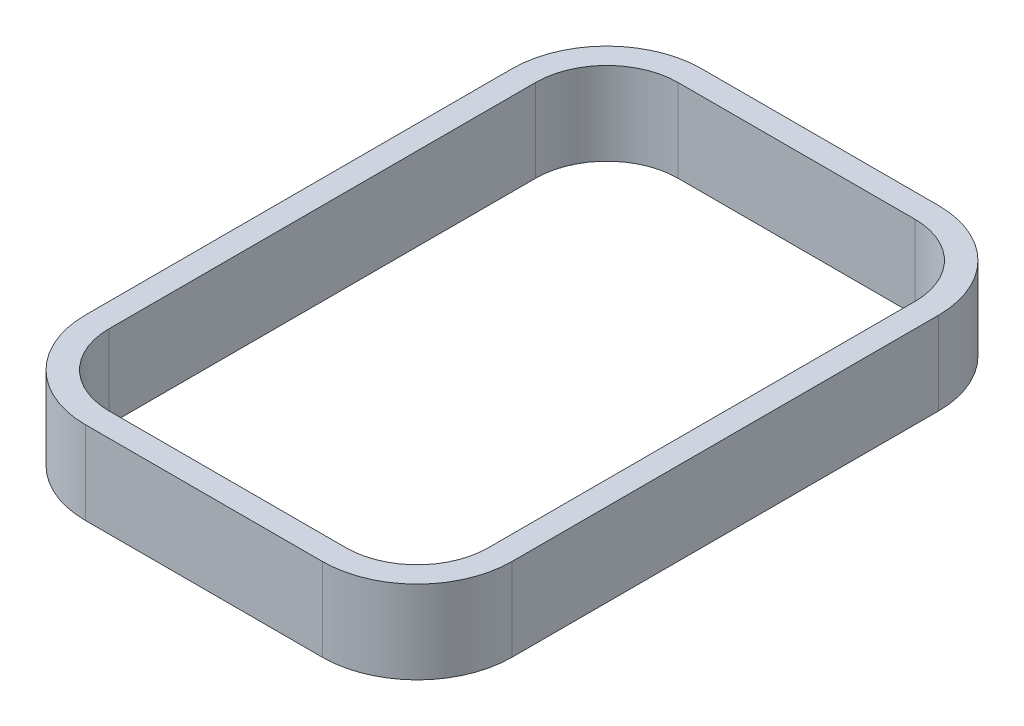
ISO-10303-21;
HEADER;
FILE_DESCRIPTION(('STEP AP214'),'2;1');
FILE_NAME('part.step','',(''),(''),'','','');
FILE_SCHEMA(('AUTOMOTIVE_DESIGN { 1 0 10303 214 1 1 1 1 }'));
ENDSEC;
DATA;
#1=APPLICATION_CONTEXT('core data for automotive mechanical design processes');
#2=APPLICATION_PROTOCOL_DEFINITION('international standard','automotive_design',2000,#1);
#3=PRODUCT_CONTEXT('',#1,'mechanical');
#4=PRODUCT('Part','Part','',(#3));
#5=PRODUCT_RELATED_PRODUCT_CATEGORY('part','',(#4));
#6=PRODUCT_DEFINITION_FORMATION('','',#4);
#7=PRODUCT_DEFINITION_CONTEXT('part definition',#1,'design');
#8=PRODUCT_DEFINITION('design','',#6,#7);
#9=PRODUCT_DEFINITION_SHAPE('','',#8);
#10=(LENGTH_UNIT() NAMED_UNIT(*) SI_UNIT(.MILLI.,.METRE.));
#11=(NAMED_UNIT(*) PLANE_ANGLE_UNIT() SI_UNIT($,.RADIAN.));
#12=(NAMED_UNIT(*) SI_UNIT($,.STERADIAN.) SOLID_ANGLE_UNIT());
#13=UNCERTAINTY_MEASURE_WITH_UNIT(LENGTH_MEASURE(1.E-05),#10,'distance_accuracy_value','');
#14=(GEOMETRIC_REPRESENTATION_CONTEXT(3) GLOBAL_UNCERTAINTY_ASSIGNED_CONTEXT((#13)) GLOBAL_UNIT_ASSIGNED_CONTEXT((#10,
#11,#12)) REPRESENTATION_CONTEXT('',''));
#15=CARTESIAN_POINT('',(0.,0.,0.));
#16=DIRECTION('',(0.,0.,1.));
#17=DIRECTION('',(1.,0.,0.));
#18=AXIS2_PLACEMENT_3D('',#15,#16,#17);
#19=CARTESIAN_POINT('',(50.,35.,90.0000000000001));
#20=DIRECTION('',(0.,1.,0.));
#21=DIRECTION('',(0.,0.,1.));
#22=AXIS2_PLACEMENT_3D('',#19,#20,#21);
#23=CYLINDRICAL_SURFACE('',#22,30.);
#24=CARTESIAN_POINT('',(50.,35.,90.0000000000001));
#25=DIRECTION('',(0.,-1.,0.));
#26=DIRECTION('',(0.,0.,-1.));
#27=AXIS2_PLACEMENT_3D('',#24,#25,#26);
#28=CIRCLE('',#27,30.);
#29=CARTESIAN_POINT('',(50.,35.,120.));
#30=VERTEX_POINT('',#29);
#31=CARTESIAN_POINT('',(80.,35.,90.0000000000001));
#32=VERTEX_POINT('',#31);
#33=EDGE_CURVE('E199',#30,#32,#28,.F.);
#34=ORIENTED_EDGE('',*,*,#33,.T.);
#35=DIRECTION('',(0.,-1.,0.));
#36=VECTOR('',#35,1.);
#37=CARTESIAN_POINT('',(80.,0.,90.0000000000001));
#38=LINE('',#37,#36);
#39=CARTESIAN_POINT('',(80.,0.,90.0000000000001));
#40=VERTEX_POINT('',#39);
#41=EDGE_CURVE('E158',#32,#40,#38,.T.);
#42=ORIENTED_EDGE('',*,*,#41,.T.);
#43=CARTESIAN_POINT('',(50.,0.,90.0000000000001));
#44=DIRECTION('',(0.,-1.,0.));
#45=DIRECTION('',(0.,0.,-1.));
#46=AXIS2_PLACEMENT_3D('',#43,#44,#45);
#47=CIRCLE('',#46,30.);
#48=CARTESIAN_POINT('',(50.,0.,120.));
#49=VERTEX_POINT('',#48);
#50=EDGE_CURVE('E173',#40,#49,#47,.T.);
#51=ORIENTED_EDGE('',*,*,#50,.T.);
#52=DIRECTION('',(0.,-1.,0.));
#53=VECTOR('',#52,1.);
#54=CARTESIAN_POINT('',(50.,35.,120.));
#55=LINE('',#54,#53);
#56=EDGE_CURVE('E191',#49,#30,#55,.F.);
#57=ORIENTED_EDGE('',*,*,#56,.T.);
#58=EDGE_LOOP('',(#34,#42,#51,#57));
#59=FACE_BOUND('',#58,.T.);
#60=ADVANCED_FACE('F32',(#59),#23,.F.);
#61=CARTESIAN_POINT('',(-80.,35.,120.));
#62=DIRECTION('',(0.,0.,-1.));
#63=DIRECTION('',(-1.,0.,0.));
#64=AXIS2_PLACEMENT_3D('',#61,#62,#63);
#65=PLANE('',#64);
#66=DIRECTION('',(1.,0.,0.));
#67=VECTOR('',#66,1.);
#68=CARTESIAN_POINT('',(-80.,0.,120.));
#69=LINE('',#68,#67);
#70=CARTESIAN_POINT('',(-50.,0.,120.));
#71=VERTEX_POINT('',#70);
#72=EDGE_CURVE('E174',#71,#49,#69,.T.);
#73=ORIENTED_EDGE('',*,*,#72,.F.);
#74=DIRECTION('',(0.,-1.,0.));
#75=VECTOR('',#74,1.);
#76=CARTESIAN_POINT('',(-50.,35.,120.));
#77=LINE('',#76,#75);
#78=CARTESIAN_POINT('',(-50.,35.,120.));
#79=VERTEX_POINT('',#78);
#80=EDGE_CURVE('E189',#79,#71,#77,.T.);
#81=ORIENTED_EDGE('',*,*,#80,.F.);
#82=DIRECTION('',(1.,0.,0.));
#83=VECTOR('',#82,1.);
#84=CARTESIAN_POINT('',(-80.,35.,120.));
#85=LINE('',#84,#83);
#86=EDGE_CURVE('E182',#79,#30,#85,.T.);
#87=ORIENTED_EDGE('',*,*,#86,.T.);
#88=ORIENTED_EDGE('',*,*,#56,.F.);
#89=EDGE_LOOP('',(#73,#81,#87,#88));
#90=FACE_BOUND('',#89,.T.);
#91=ADVANCED_FACE('F308',(#90),#65,.T.);
#92=CARTESIAN_POINT('',(-50.,35.,90.0000000000001));
#93=DIRECTION('',(0.,-1.,0.));
#94=DIRECTION('',(0.,0.,-1.));
#95=AXIS2_PLACEMENT_3D('',#92,#93,#94);
#96=CYLINDRICAL_SURFACE('',#95,30.);
#97=CARTESIAN_POINT('',(-50.,35.,90.0000000000001));
#98=DIRECTION('',(0.,-1.,0.));
#99=DIRECTION('',(0.,0.,-1.));
#100=AXIS2_PLACEMENT_3D('',#97,#98,#99);
#101=CIRCLE('',#100,30.);
#102=CARTESIAN_POINT('',(-80.,35.,90.0000000000001));
#103=VERTEX_POINT('',#102);
#104=EDGE_CURVE('E197',#103,#79,#101,.F.);
#105=ORIENTED_EDGE('',*,*,#104,.T.);
#106=ORIENTED_EDGE('',*,*,#80,.T.);
#107=CARTESIAN_POINT('',(-50.,0.,90.0000000000001));
#108=DIRECTION('',(0.,-1.,0.));
#109=DIRECTION('',(0.,0.,-1.));
#110=AXIS2_PLACEMENT_3D('',#107,#108,#109);
#111=CIRCLE('',#110,30.);
#112=CARTESIAN_POINT('',(-80.,0.,90.0000000000001));
#113=VERTEX_POINT('',#112);
#114=EDGE_CURVE('E186',#71,#113,#111,.T.);
#115=ORIENTED_EDGE('',*,*,#114,.T.);
#116=DIRECTION('',(0.,-1.,0.));
#117=VECTOR('',#116,1.);
#118=CARTESIAN_POINT('',(-80.,35.,90.0000000000001));
#119=LINE('',#118,#117);
#120=EDGE_CURVE('E203',#113,#103,#119,.F.);
#121=ORIENTED_EDGE('',*,*,#120,.T.);
#122=EDGE_LOOP('',(#105,#106,#115,#121));
#123=FACE_BOUND('',#122,.T.);
#124=ADVANCED_FACE('F316',(#123),#96,.F.);
#125=CARTESIAN_POINT('',(-80.,35.,-120.));
#126=DIRECTION('',(1.,0.,0.));
#127=DIRECTION('',(0.,0.,-1.));
#128=AXIS2_PLACEMENT_3D('',#125,#126,#127);
#129=PLANE('',#128);
#130=DIRECTION('',(0.,0.,1.));
#131=VECTOR('',#130,1.);
#132=CARTESIAN_POINT('',(-80.,0.,-120.));
#133=LINE('',#132,#131);
#134=CARTESIAN_POINT('',(-80.,0.,-89.9999999999999));
#135=VERTEX_POINT('',#134);
#136=EDGE_CURVE('E176',#135,#113,#133,.T.);
#137=ORIENTED_EDGE('',*,*,#136,.F.);
#138=DIRECTION('',(0.,-1.,0.));
#139=VECTOR('',#138,1.);
#140=CARTESIAN_POINT('',(-80.,0.,-89.9999999999999));
#141=LINE('',#140,#139);
#142=CARTESIAN_POINT('',(-80.,35.,-89.9999999999999));
#143=VERTEX_POINT('',#142);
#144=EDGE_CURVE('E201',#143,#135,#141,.T.);
#145=ORIENTED_EDGE('',*,*,#144,.F.);
#146=DIRECTION('',(0.,0.,1.));
#147=VECTOR('',#146,1.);
#148=CARTESIAN_POINT('',(-80.,35.,-120.));
#149=LINE('',#148,#147);
#150=EDGE_CURVE('E49',#143,#103,#149,.T.);
#151=ORIENTED_EDGE('',*,*,#150,.T.);
#152=ORIENTED_EDGE('',*,*,#120,.F.);
#153=EDGE_LOOP('',(#137,#145,#151,#152));
#154=FACE_BOUND('',#153,.T.);
#155=ADVANCED_FACE('F322',(#154),#129,.T.);
#156=CARTESIAN_POINT('',(-50.,35.,-89.9999999999999));
#157=DIRECTION('',(0.,1.,0.));
#158=DIRECTION('',(0.,0.,1.));
#159=AXIS2_PLACEMENT_3D('',#156,#157,#158);
#160=CYLINDRICAL_SURFACE('',#159,30.);
#161=CARTESIAN_POINT('',(-50.,35.,-89.9999999999999));
#162=DIRECTION('',(0.,-1.,0.));
#163=DIRECTION('',(0.,0.,-1.));
#164=AXIS2_PLACEMENT_3D('',#161,#162,#163);
#165=CIRCLE('',#164,30.);
#166=CARTESIAN_POINT('',(-50.,35.,-120.));
#167=VERTEX_POINT('',#166);
#168=EDGE_CURVE('E195',#167,#143,#165,.F.);
#169=ORIENTED_EDGE('',*,*,#168,.T.);
#170=ORIENTED_EDGE('',*,*,#144,.T.);
#171=CARTESIAN_POINT('',(-50.,0.,-89.9999999999999));
#172=DIRECTION('',(0.,-1.,0.));
#173=DIRECTION('',(0.,0.,-1.));
#174=AXIS2_PLACEMENT_3D('',#171,#172,#173);
#175=CIRCLE('',#174,30.);
#176=CARTESIAN_POINT('',(-50.,0.,-120.));
#177=VERTEX_POINT('',#176);
#178=EDGE_CURVE('E157',#135,#177,#175,.T.);
#179=ORIENTED_EDGE('',*,*,#178,.T.);
#180=DIRECTION('',(0.,-1.,0.));
#181=VECTOR('',#180,1.);
#182=CARTESIAN_POINT('',(-50.,35.,-120.));
#183=LINE('',#182,#181);
#184=EDGE_CURVE('E206',#177,#167,#183,.F.);
#185=ORIENTED_EDGE('',*,*,#184,.T.);
#186=EDGE_LOOP('',(#169,#170,#179,#185));
#187=FACE_BOUND('',#186,.T.);
#188=ADVANCED_FACE('F324',(#187),#160,.F.);
#189=CARTESIAN_POINT('',(-80.,35.,-120.));
#190=DIRECTION('',(0.,0.,-1.));
#191=DIRECTION('',(-1.,0.,0.));
#192=AXIS2_PLACEMENT_3D('',#189,#190,#191);
#193=PLANE('',#192);
#194=DIRECTION('',(1.,0.,0.));
#195=VECTOR('',#194,1.);
#196=CARTESIAN_POINT('',(-80.,0.,-120.));
#197=LINE('',#196,#195);
#198=CARTESIAN_POINT('',(50.,0.,-120.));
#199=VERTEX_POINT('',#198);
#200=EDGE_CURVE('E57',#177,#199,#197,.T.);
#201=ORIENTED_EDGE('',*,*,#200,.T.);
#202=DIRECTION('',(0.,-1.,0.));
#203=VECTOR('',#202,1.);
#204=CARTESIAN_POINT('',(50.,35.,-120.));
#205=LINE('',#204,#203);
#206=CARTESIAN_POINT('',(50.,35.,-120.));
#207=VERTEX_POINT('',#206);
#208=EDGE_CURVE('E154',#207,#199,#205,.T.);
#209=ORIENTED_EDGE('',*,*,#208,.F.);
#210=DIRECTION('',(1.,0.,0.));
#211=VECTOR('',#210,1.);
#212=CARTESIAN_POINT('',(-80.,35.,-120.));
#213=LINE('',#212,#211);
#214=EDGE_CURVE('E455',#167,#207,#213,.T.);
#215=ORIENTED_EDGE('',*,*,#214,.F.);
#216=ORIENTED_EDGE('',*,*,#184,.F.);
#217=EDGE_LOOP('',(#201,#209,#215,#216));
#218=FACE_BOUND('',#217,.T.);
#219=ADVANCED_FACE('F327',(#218),#193,.F.);
#220=CARTESIAN_POINT('',(50.,35.,-89.9999999999999));
#221=DIRECTION('',(0.,-1.,0.));
#222=DIRECTION('',(0.,0.,-1.));
#223=AXIS2_PLACEMENT_3D('',#220,#221,#222);
#224=CYLINDRICAL_SURFACE('',#223,30.);
#225=CARTESIAN_POINT('',(50.,35.,-89.9999999999999));
#226=DIRECTION('',(0.,-1.,0.));
#227=DIRECTION('',(0.,0.,-1.));
#228=AXIS2_PLACEMENT_3D('',#225,#226,#227);
#229=CIRCLE('',#228,30.);
#230=CARTESIAN_POINT('',(80.,35.,-89.9999999999999));
#231=VERTEX_POINT('',#230);
#232=EDGE_CURVE('E193',#231,#207,#229,.F.);
#233=ORIENTED_EDGE('',*,*,#232,.T.);
#234=ORIENTED_EDGE('',*,*,#208,.T.);
#235=CARTESIAN_POINT('',(50.,0.,-89.9999999999999));
#236=DIRECTION('',(0.,-1.,0.));
#237=DIRECTION('',(0.,0.,-1.));
#238=AXIS2_PLACEMENT_3D('',#235,#236,#237);
#239=CIRCLE('',#238,30.);
#240=CARTESIAN_POINT('',(80.,0.,-89.9999999999999));
#241=VERTEX_POINT('',#240);
#242=EDGE_CURVE('E149',#199,#241,#239,.T.);
#243=ORIENTED_EDGE('',*,*,#242,.T.);
#244=DIRECTION('',(0.,-1.,0.));
#245=VECTOR('',#244,1.);
#246=CARTESIAN_POINT('',(80.,35.,-89.9999999999999));
#247=LINE('',#246,#245);
#248=EDGE_CURVE('E152',#241,#231,#247,.F.);
#249=ORIENTED_EDGE('',*,*,#248,.T.);
#250=EDGE_LOOP('',(#233,#234,#243,#249));
#251=FACE_BOUND('',#250,.T.);
#252=ADVANCED_FACE('F151',(#251),#224,.F.);
#253=CARTESIAN_POINT('',(80.,35.,-120.));
#254=DIRECTION('',(1.,0.,0.));
#255=DIRECTION('',(0.,0.,-1.));
#256=AXIS2_PLACEMENT_3D('',#253,#254,#255);
#257=PLANE('',#256);
#258=DIRECTION('',(0.,0.,1.));
#259=VECTOR('',#258,1.);
#260=CARTESIAN_POINT('',(80.,35.,-120.));
#261=LINE('',#260,#259);
#262=EDGE_CURVE('E167',#231,#32,#261,.T.);
#263=ORIENTED_EDGE('',*,*,#262,.F.);
#264=ORIENTED_EDGE('',*,*,#248,.F.);
#265=DIRECTION('',(0.,0.,1.));
#266=VECTOR('',#265,1.);
#267=CARTESIAN_POINT('',(80.,0.,-120.));
#268=LINE('',#267,#266);
#269=EDGE_CURVE('E164',#241,#40,#268,.T.);
#270=ORIENTED_EDGE('',*,*,#269,.T.);
#271=ORIENTED_EDGE('',*,*,#41,.F.);
#272=EDGE_LOOP('',(#263,#264,#270,#271));
#273=FACE_BOUND('',#272,.T.);
#274=ADVANCED_FACE('F162',(#273),#257,.F.);
#275=CARTESIAN_POINT('',(0.,0.,0.));
#276=DIRECTION('',(0.,-1.,0.));
#277=DIRECTION('',(0.,0.,-1.));
#278=AXIS2_PLACEMENT_3D('',#275,#276,#277);
#279=PLANE('',#278);
#280=ORIENTED_EDGE('',*,*,#269,.F.);
#281=ORIENTED_EDGE('',*,*,#242,.F.);
#282=ORIENTED_EDGE('',*,*,#200,.F.);
#283=ORIENTED_EDGE('',*,*,#178,.F.);
#284=ORIENTED_EDGE('',*,*,#136,.T.);
#285=ORIENTED_EDGE('',*,*,#114,.F.);
#286=ORIENTED_EDGE('',*,*,#72,.T.);
#287=ORIENTED_EDGE('',*,*,#50,.F.);
#288=EDGE_LOOP('',(#280,#281,#282,#283,#284,#285,#286,#287));
#289=FACE_BOUND('',#288,.T.);
#290=DIRECTION('',(0.,0.,1.));
#291=VECTOR('',#290,1.);
#292=CARTESIAN_POINT('',(90.,0.,0.));
#293=LINE('',#292,#291);
#294=CARTESIAN_POINT('',(90.,0.,-89.9999999999999));
#295=VERTEX_POINT('',#294);
#296=CARTESIAN_POINT('',(90.,0.,90.0000000000001));
#297=VERTEX_POINT('',#296);
#298=EDGE_CURVE('E233',#295,#297,#293,.T.);
#299=ORIENTED_EDGE('',*,*,#298,.T.);
#300=CARTESIAN_POINT('',(50.,0.,90.0000000000001));
#301=DIRECTION('',(0.,-1.,0.));
#302=DIRECTION('',(0.,0.,-1.));
#303=AXIS2_PLACEMENT_3D('',#300,#301,#302);
#304=CIRCLE('',#303,40.);
#305=CARTESIAN_POINT('',(50.,0.,130.));
#306=VERTEX_POINT('',#305);
#307=EDGE_CURVE('E215',#297,#306,#304,.T.);
#308=ORIENTED_EDGE('',*,*,#307,.T.);
#309=DIRECTION('',(1.,0.,0.));
#310=VECTOR('',#309,1.);
#311=CARTESIAN_POINT('',(0.,0.,130.));
#312=LINE('',#311,#310);
#313=CARTESIAN_POINT('',(-50.,0.,130.));
#314=VERTEX_POINT('',#313);
#315=EDGE_CURVE('E208',#314,#306,#312,.T.);
#316=ORIENTED_EDGE('',*,*,#315,.F.);
#317=CARTESIAN_POINT('',(-50.,0.,90.0000000000001));
#318=DIRECTION('',(0.,-1.,0.));
#319=DIRECTION('',(0.,0.,-1.));
#320=AXIS2_PLACEMENT_3D('',#317,#318,#319);
#321=CIRCLE('',#320,40.);
#322=CARTESIAN_POINT('',(-90.,0.,90.0000000000001));
#323=VERTEX_POINT('',#322);
#324=EDGE_CURVE('E234',#314,#323,#321,.T.);
#325=ORIENTED_EDGE('',*,*,#324,.T.);
#326=DIRECTION('',(0.,0.,1.));
#327=VECTOR('',#326,1.);
#328=CARTESIAN_POINT('',(-90.,0.,0.));
#329=LINE('',#328,#327);
#330=CARTESIAN_POINT('',(-90.,0.,-90.));
#331=VERTEX_POINT('',#330);
#332=EDGE_CURVE('E237',#331,#323,#329,.T.);
#333=ORIENTED_EDGE('',*,*,#332,.F.);
#334=CARTESIAN_POINT('',(-50.,0.,-89.9999999999999));
#335=DIRECTION('',(0.,-1.,0.));
#336=DIRECTION('',(0.,0.,-1.));
#337=AXIS2_PLACEMENT_3D('',#334,#335,#336);
#338=CIRCLE('',#337,40.);
#339=CARTESIAN_POINT('',(-50.,0.,-130.));
#340=VERTEX_POINT('',#339);
#341=EDGE_CURVE('E236',#331,#340,#338,.T.);
#342=ORIENTED_EDGE('',*,*,#341,.T.);
#343=DIRECTION('',(1.,0.,0.));
#344=VECTOR('',#343,1.);
#345=CARTESIAN_POINT('',(0.,0.,-130.));
#346=LINE('',#345,#344);
#347=CARTESIAN_POINT('',(50.,0.,-130.));
#348=VERTEX_POINT('',#347);
#349=EDGE_CURVE('E241',#340,#348,#346,.T.);
#350=ORIENTED_EDGE('',*,*,#349,.T.);
#351=CARTESIAN_POINT('',(50.,0.,-89.9999999999999));
#352=DIRECTION('',(0.,-1.,0.));
#353=DIRECTION('',(0.,0.,-1.));
#354=AXIS2_PLACEMENT_3D('',#351,#352,#353);
#355=CIRCLE('',#354,40.);
#356=EDGE_CURVE('E219',#348,#295,#355,.T.);
#357=ORIENTED_EDGE('',*,*,#356,.T.);
#358=EDGE_LOOP('',(#299,#308,#316,#325,#333,#342,#350,#357));
#359=FACE_BOUND('',#358,.T.);
#360=ADVANCED_FACE('F170',(#289,#359),#279,.T.);
#361=CARTESIAN_POINT('',(0.,35.,0.));
#362=DIRECTION('',(0.,-1.,0.));
#363=DIRECTION('',(0.,0.,-1.));
#364=AXIS2_PLACEMENT_3D('',#361,#362,#363);
#365=PLANE('',#364);
#366=ORIENTED_EDGE('',*,*,#86,.F.);
#367=ORIENTED_EDGE('',*,*,#104,.F.);
#368=ORIENTED_EDGE('',*,*,#150,.F.);
#369=ORIENTED_EDGE('',*,*,#168,.F.);
#370=ORIENTED_EDGE('',*,*,#214,.T.);
#371=ORIENTED_EDGE('',*,*,#232,.F.);
#372=ORIENTED_EDGE('',*,*,#262,.T.);
#373=ORIENTED_EDGE('',*,*,#33,.F.);
#374=EDGE_LOOP('',(#366,#367,#368,#369,#370,#371,#372,#373));
#375=FACE_BOUND('',#374,.T.);
#376=DIRECTION('',(1.,0.,0.));
#377=VECTOR('',#376,1.);
#378=CARTESIAN_POINT('',(0.,35.,130.));
#379=LINE('',#378,#377);
#380=CARTESIAN_POINT('',(-50.,35.,130.));
#381=VERTEX_POINT('',#380);
#382=CARTESIAN_POINT('',(50.,35.,130.));
#383=VERTEX_POINT('',#382);
#384=EDGE_CURVE('E240',#381,#383,#379,.T.);
#385=ORIENTED_EDGE('',*,*,#384,.T.);
#386=CARTESIAN_POINT('',(50.,35.,90.0000000000001));
#387=DIRECTION('',(0.,-1.,0.));
#388=DIRECTION('',(0.,0.,-1.));
#389=AXIS2_PLACEMENT_3D('',#386,#387,#388);
#390=CIRCLE('',#389,40.);
#391=CARTESIAN_POINT('',(90.,35.,90.0000000000001));
#392=VERTEX_POINT('',#391);
#393=EDGE_CURVE('E229',#383,#392,#390,.F.);
#394=ORIENTED_EDGE('',*,*,#393,.T.);
#395=DIRECTION('',(0.,0.,1.));
#396=VECTOR('',#395,1.);
#397=CARTESIAN_POINT('',(90.,35.,0.));
#398=LINE('',#397,#396);
#399=CARTESIAN_POINT('',(90.,35.,-89.9999999999999));
#400=VERTEX_POINT('',#399);
#401=EDGE_CURVE('E251',#400,#392,#398,.T.);
#402=ORIENTED_EDGE('',*,*,#401,.F.);
#403=CARTESIAN_POINT('',(50.,35.,-89.9999999999999));
#404=DIRECTION('',(0.,-1.,0.));
#405=DIRECTION('',(0.,0.,-1.));
#406=AXIS2_PLACEMENT_3D('',#403,#404,#405);
#407=CIRCLE('',#406,40.);
#408=CARTESIAN_POINT('',(50.,35.,-130.));
#409=VERTEX_POINT('',#408);
#410=EDGE_CURVE('E211',#400,#409,#407,.F.);
#411=ORIENTED_EDGE('',*,*,#410,.T.);
#412=DIRECTION('',(1.,0.,0.));
#413=VECTOR('',#412,1.);
#414=CARTESIAN_POINT('',(0.,35.,-130.));
#415=LINE('',#414,#413);
#416=CARTESIAN_POINT('',(-50.,35.,-130.));
#417=VERTEX_POINT('',#416);
#418=EDGE_CURVE('E255',#417,#409,#415,.T.);
#419=ORIENTED_EDGE('',*,*,#418,.F.);
#420=CARTESIAN_POINT('',(-50.,35.,-89.9999999999999));
#421=DIRECTION('',(0.,-1.,0.));
#422=DIRECTION('',(0.,0.,-1.));
#423=AXIS2_PLACEMENT_3D('',#420,#421,#422);
#424=CIRCLE('',#423,40.);
#425=CARTESIAN_POINT('',(-90.,35.,-89.9999999999999));
#426=VERTEX_POINT('',#425);
#427=EDGE_CURVE('E257',#417,#426,#424,.F.);
#428=ORIENTED_EDGE('',*,*,#427,.T.);
#429=DIRECTION('',(0.,0.,1.));
#430=VECTOR('',#429,1.);
#431=CARTESIAN_POINT('',(-90.,35.,0.));
#432=LINE('',#431,#430);
#433=CARTESIAN_POINT('',(-90.,35.,90.0000000000001));
#434=VERTEX_POINT('',#433);
#435=EDGE_CURVE('E222',#426,#434,#432,.T.);
#436=ORIENTED_EDGE('',*,*,#435,.T.);
#437=CARTESIAN_POINT('',(-50.,35.,90.0000000000001));
#438=DIRECTION('',(0.,-1.,0.));
#439=DIRECTION('',(0.,0.,-1.));
#440=AXIS2_PLACEMENT_3D('',#437,#438,#439);
#441=CIRCLE('',#440,40.);
#442=EDGE_CURVE('E36',#434,#381,#441,.F.);
#443=ORIENTED_EDGE('',*,*,#442,.T.);
#444=EDGE_LOOP('',(#385,#394,#402,#411,#419,#428,#436,#443));
#445=FACE_BOUND('',#444,.T.);
#446=ADVANCED_FACE('F264',(#375,#445),#365,.F.);
#447=CARTESIAN_POINT('',(50.,35.,-89.9999999999999));
#448=DIRECTION('',(0.,-1.,0.));
#449=DIRECTION('',(0.,0.,-1.));
#450=AXIS2_PLACEMENT_3D('',#447,#448,#449);
#451=CYLINDRICAL_SURFACE('',#450,40.);
#452=ORIENTED_EDGE('',*,*,#410,.F.);
#453=DIRECTION('',(0.,1.,0.));
#454=VECTOR('',#453,1.);
#455=CARTESIAN_POINT('',(90.,35.,-89.9999999999999));
#456=LINE('',#455,#454);
#457=EDGE_CURVE('E220',#295,#400,#456,.T.);
#458=ORIENTED_EDGE('',*,*,#457,.F.);
#459=ORIENTED_EDGE('',*,*,#356,.F.);
#460=DIRECTION('',(0.,1.,0.));
#461=VECTOR('',#460,1.);
#462=CARTESIAN_POINT('',(50.,35.,-130.));
#463=LINE('',#462,#461);
#464=EDGE_CURVE('E41',#409,#348,#463,.F.);
#465=ORIENTED_EDGE('',*,*,#464,.F.);
#466=EDGE_LOOP('',(#452,#458,#459,#465));
#467=FACE_BOUND('',#466,.T.);
#468=ADVANCED_FACE('F34',(#467),#451,.T.);
#469=CARTESIAN_POINT('',(-50.,35.,-89.9999999999999));
#470=DIRECTION('',(0.,1.,0.));
#471=DIRECTION('',(0.,0.,1.));
#472=AXIS2_PLACEMENT_3D('',#469,#470,#471);
#473=CYLINDRICAL_SURFACE('',#472,40.);
#474=ORIENTED_EDGE('',*,*,#427,.F.);
#475=DIRECTION('',(0.,1.,0.));
#476=VECTOR('',#475,1.);
#477=CARTESIAN_POINT('',(-50.,35.,-130.));
#478=LINE('',#477,#476);
#479=EDGE_CURVE('E11',#340,#417,#478,.T.);
#480=ORIENTED_EDGE('',*,*,#479,.F.);
#481=ORIENTED_EDGE('',*,*,#341,.F.);
#482=DIRECTION('',(0.,1.,0.));
#483=VECTOR('',#482,1.);
#484=CARTESIAN_POINT('',(-90.,35.,-89.9999999999999));
#485=LINE('',#484,#483);
#486=EDGE_CURVE('E226',#426,#331,#485,.F.);
#487=ORIENTED_EDGE('',*,*,#486,.F.);
#488=EDGE_LOOP('',(#474,#480,#481,#487));
#489=FACE_BOUND('',#488,.T.);
#490=ADVANCED_FACE('F296',(#489),#473,.T.);
#491=CARTESIAN_POINT('',(-50.,35.,90.0000000000001));
#492=DIRECTION('',(0.,-1.,0.));
#493=DIRECTION('',(0.,0.,-1.));
#494=AXIS2_PLACEMENT_3D('',#491,#492,#493);
#495=CYLINDRICAL_SURFACE('',#494,40.);
#496=ORIENTED_EDGE('',*,*,#442,.F.);
#497=DIRECTION('',(0.,1.,0.));
#498=VECTOR('',#497,1.);
#499=CARTESIAN_POINT('',(-90.,35.,90.0000000000001));
#500=LINE('',#499,#498);
#501=EDGE_CURVE('E224',#323,#434,#500,.T.);
#502=ORIENTED_EDGE('',*,*,#501,.F.);
#503=ORIENTED_EDGE('',*,*,#324,.F.);
#504=DIRECTION('',(0.,1.,0.));
#505=VECTOR('',#504,1.);
#506=CARTESIAN_POINT('',(-50.,35.,130.));
#507=LINE('',#506,#505);
#508=EDGE_CURVE('E212',#381,#314,#507,.F.);
#509=ORIENTED_EDGE('',*,*,#508,.F.);
#510=EDGE_LOOP('',(#496,#502,#503,#509));
#511=FACE_BOUND('',#510,.T.);
#512=ADVANCED_FACE('F273',(#511),#495,.T.);
#513=CARTESIAN_POINT('',(50.,35.,90.0000000000001));
#514=DIRECTION('',(0.,1.,0.));
#515=DIRECTION('',(0.,0.,1.));
#516=AXIS2_PLACEMENT_3D('',#513,#514,#515);
#517=CYLINDRICAL_SURFACE('',#516,40.);
#518=ORIENTED_EDGE('',*,*,#393,.F.);
#519=DIRECTION('',(0.,1.,0.));
#520=VECTOR('',#519,1.);
#521=CARTESIAN_POINT('',(50.,35.,130.));
#522=LINE('',#521,#520);
#523=EDGE_CURVE('E209',#306,#383,#522,.T.);
#524=ORIENTED_EDGE('',*,*,#523,.F.);
#525=ORIENTED_EDGE('',*,*,#307,.F.);
#526=DIRECTION('',(0.,1.,0.));
#527=VECTOR('',#526,1.);
#528=CARTESIAN_POINT('',(90.,35.,90.0000000000001));
#529=LINE('',#528,#527);
#530=EDGE_CURVE('E216',#392,#297,#529,.F.);
#531=ORIENTED_EDGE('',*,*,#530,.F.);
#532=EDGE_LOOP('',(#518,#524,#525,#531));
#533=FACE_BOUND('',#532,.T.);
#534=ADVANCED_FACE('F283',(#533),#517,.T.);
#535=CARTESIAN_POINT('',(90.,35.,-120.));
#536=DIRECTION('',(1.,0.,0.));
#537=DIRECTION('',(0.,0.,-1.));
#538=AXIS2_PLACEMENT_3D('',#535,#536,#537);
#539=PLANE('',#538);
#540=ORIENTED_EDGE('',*,*,#401,.T.);
#541=ORIENTED_EDGE('',*,*,#530,.T.);
#542=ORIENTED_EDGE('',*,*,#298,.F.);
#543=ORIENTED_EDGE('',*,*,#457,.T.);
#544=EDGE_LOOP('',(#540,#541,#542,#543));
#545=FACE_BOUND('',#544,.T.);
#546=ADVANCED_FACE('F285',(#545),#539,.T.);
#547=CARTESIAN_POINT('',(-80.,35.,-130.));
#548=DIRECTION('',(0.,0.,-1.));
#549=DIRECTION('',(-1.,0.,0.));
#550=AXIS2_PLACEMENT_3D('',#547,#548,#549);
#551=PLANE('',#550);
#552=ORIENTED_EDGE('',*,*,#349,.F.);
#553=ORIENTED_EDGE('',*,*,#479,.T.);
#554=ORIENTED_EDGE('',*,*,#418,.T.);
#555=ORIENTED_EDGE('',*,*,#464,.T.);
#556=EDGE_LOOP('',(#552,#553,#554,#555));
#557=FACE_BOUND('',#556,.T.);
#558=ADVANCED_FACE('F293',(#557),#551,.T.);
#559=CARTESIAN_POINT('',(-90.,35.,-120.));
#560=DIRECTION('',(1.,0.,0.));
#561=DIRECTION('',(0.,0.,-1.));
#562=AXIS2_PLACEMENT_3D('',#559,#560,#561);
#563=PLANE('',#562);
#564=ORIENTED_EDGE('',*,*,#332,.T.);
#565=ORIENTED_EDGE('',*,*,#501,.T.);
#566=ORIENTED_EDGE('',*,*,#435,.F.);
#567=ORIENTED_EDGE('',*,*,#486,.T.);
#568=EDGE_LOOP('',(#564,#565,#566,#567));
#569=FACE_BOUND('',#568,.T.);
#570=ADVANCED_FACE('F297',(#569),#563,.F.);
#571=CARTESIAN_POINT('',(-80.,35.,130.));
#572=DIRECTION('',(0.,0.,-1.));
#573=DIRECTION('',(-1.,0.,0.));
#574=AXIS2_PLACEMENT_3D('',#571,#572,#573);
#575=PLANE('',#574);
#576=ORIENTED_EDGE('',*,*,#315,.T.);
#577=ORIENTED_EDGE('',*,*,#523,.T.);
#578=ORIENTED_EDGE('',*,*,#384,.F.);
#579=ORIENTED_EDGE('',*,*,#508,.T.);
#580=EDGE_LOOP('',(#576,#577,#578,#579));
#581=FACE_BOUND('',#580,.T.);
#582=ADVANCED_FACE('F276',(#581),#575,.F.);
#583=CLOSED_SHELL('',(#60,#91,#124,#155,#188,#219,#252,#274,#360,#446,#468,#490,#512,#534,#546,
#558,#570,#582));
#584=MANIFOLD_SOLID_BREP('B2',#583);
#585=ADVANCED_BREP_SHAPE_REPRESENTATION('',(#18,#584),#14);
#586=SHAPE_DEFINITION_REPRESENTATION(#9,#585);
ENDSEC;
END-ISO-10303-21;
